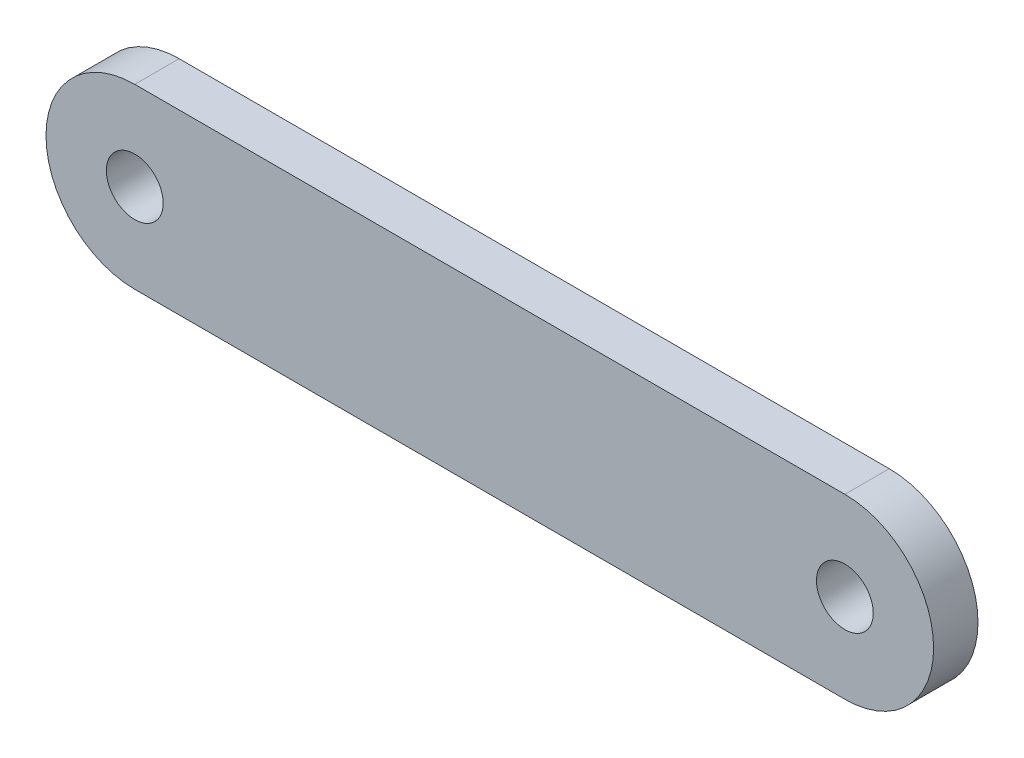
ISO-10303-21;
HEADER;
FILE_DESCRIPTION(('STEP AP214'),'2;1');
FILE_NAME('part.step','',(''),(''),'','','');
FILE_SCHEMA(('AUTOMOTIVE_DESIGN { 1 0 10303 214 1 1 1 1 }'));
ENDSEC;
DATA;
#1=APPLICATION_CONTEXT('core data for automotive mechanical design processes');
#2=APPLICATION_PROTOCOL_DEFINITION('international standard','automotive_design',2000,#1);
#3=PRODUCT_CONTEXT('',#1,'mechanical');
#4=PRODUCT('Part','Part','',(#3));
#5=PRODUCT_RELATED_PRODUCT_CATEGORY('part','',(#4));
#6=PRODUCT_DEFINITION_FORMATION('','',#4);
#7=PRODUCT_DEFINITION_CONTEXT('part definition',#1,'design');
#8=PRODUCT_DEFINITION('design','',#6,#7);
#9=PRODUCT_DEFINITION_SHAPE('','',#8);
#10=(LENGTH_UNIT() NAMED_UNIT(*) SI_UNIT(.MILLI.,.METRE.));
#11=(NAMED_UNIT(*) PLANE_ANGLE_UNIT() SI_UNIT($,.RADIAN.));
#12=(NAMED_UNIT(*) SI_UNIT($,.STERADIAN.) SOLID_ANGLE_UNIT());
#13=UNCERTAINTY_MEASURE_WITH_UNIT(LENGTH_MEASURE(1.E-05),#10,'distance_accuracy_value','');
#14=(GEOMETRIC_REPRESENTATION_CONTEXT(3) GLOBAL_UNCERTAINTY_ASSIGNED_CONTEXT((#13)) GLOBAL_UNIT_ASSIGNED_CONTEXT((#10,
#11,#12)) REPRESENTATION_CONTEXT('',''));
#15=CARTESIAN_POINT('',(0.,0.,0.));
#16=DIRECTION('',(0.,0.,1.));
#17=DIRECTION('',(1.,0.,0.));
#18=AXIS2_PLACEMENT_3D('',#15,#16,#17);
#19=CARTESIAN_POINT('',(0.,0.,3.175));
#20=DIRECTION('',(0.,0.,1.));
#21=DIRECTION('',(1.,0.,0.));
#22=AXIS2_PLACEMENT_3D('',#19,#20,#21);
#23=PLANE('',#22);
#24=CARTESIAN_POINT('',(0.,0.,3.175));
#25=DIRECTION('',(0.,0.,1.));
#26=DIRECTION('',(1.,0.,0.));
#27=AXIS2_PLACEMENT_3D('',#24,#25,#26);
#28=CIRCLE('',#27,2.032);
#29=CARTESIAN_POINT('',(2.032,0.,3.175));
#30=VERTEX_POINT('',#29);
#31=EDGE_CURVE('E118',#30,#30,#28,.T.);
#32=ORIENTED_EDGE('',*,*,#31,.F.);
#33=EDGE_LOOP('',(#32));
#34=FACE_BOUND('',#33,.T.);
#35=CARTESIAN_POINT('',(0.,0.,3.175));
#36=DIRECTION('',(0.,0.,1.));
#37=DIRECTION('',(1.,0.,0.));
#38=AXIS2_PLACEMENT_3D('',#35,#36,#37);
#39=CIRCLE('',#38,6.35);
#40=CARTESIAN_POINT('',(0.,6.35,3.175));
#41=VERTEX_POINT('',#40);
#42=CARTESIAN_POINT('',(0.,-6.35,3.175));
#43=VERTEX_POINT('',#42);
#44=EDGE_CURVE('E98',#41,#43,#39,.T.);
#45=ORIENTED_EDGE('',*,*,#44,.T.);
#46=DIRECTION('',(1.,0.,0.));
#47=VECTOR('',#46,1.);
#48=CARTESIAN_POINT('',(0.,-6.35,3.175));
#49=LINE('',#48,#47);
#50=CARTESIAN_POINT('',(50.8,-6.35,3.175));
#51=VERTEX_POINT('',#50);
#52=EDGE_CURVE('E93',#43,#51,#49,.T.);
#53=ORIENTED_EDGE('',*,*,#52,.T.);
#54=CARTESIAN_POINT('',(50.8,0.,3.175));
#55=DIRECTION('',(0.,0.,1.));
#56=DIRECTION('',(1.,0.,0.));
#57=AXIS2_PLACEMENT_3D('',#54,#55,#56);
#58=CIRCLE('',#57,6.35);
#59=CARTESIAN_POINT('',(50.8,6.35,3.175));
#60=VERTEX_POINT('',#59);
#61=EDGE_CURVE('E96',#51,#60,#58,.T.);
#62=ORIENTED_EDGE('',*,*,#61,.T.);
#63=DIRECTION('',(-1.,0.,0.));
#64=VECTOR('',#63,1.);
#65=CARTESIAN_POINT('',(0.,6.35,3.175));
#66=LINE('',#65,#64);
#67=EDGE_CURVE('E63',#60,#41,#66,.T.);
#68=ORIENTED_EDGE('',*,*,#67,.T.);
#69=EDGE_LOOP('',(#45,#53,#62,#68));
#70=FACE_BOUND('',#69,.T.);
#71=CARTESIAN_POINT('',(50.8,0.,3.175));
#72=DIRECTION('',(0.,0.,1.));
#73=DIRECTION('',(1.,0.,0.));
#74=AXIS2_PLACEMENT_3D('',#71,#72,#73);
#75=CIRCLE('',#74,2.032);
#76=CARTESIAN_POINT('',(52.832,0.,3.175));
#77=VERTEX_POINT('',#76);
#78=EDGE_CURVE('E140',#77,#77,#75,.T.);
#79=ORIENTED_EDGE('',*,*,#78,.F.);
#80=EDGE_LOOP('',(#79));
#81=FACE_BOUND('',#80,.T.);
#82=ADVANCED_FACE('F45',(#34,#70,#81),#23,.T.);
#83=CARTESIAN_POINT('',(0.,0.,0.));
#84=DIRECTION('',(0.,0.,1.));
#85=DIRECTION('',(1.,0.,0.));
#86=AXIS2_PLACEMENT_3D('',#83,#84,#85);
#87=PLANE('',#86);
#88=CARTESIAN_POINT('',(0.,0.,0.));
#89=DIRECTION('',(0.,0.,1.));
#90=DIRECTION('',(1.,0.,0.));
#91=AXIS2_PLACEMENT_3D('',#88,#89,#90);
#92=CIRCLE('',#91,6.35);
#93=CARTESIAN_POINT('',(0.,6.35,0.));
#94=VERTEX_POINT('',#93);
#95=CARTESIAN_POINT('',(0.,-6.35,0.));
#96=VERTEX_POINT('',#95);
#97=EDGE_CURVE('E114',#94,#96,#92,.T.);
#98=ORIENTED_EDGE('',*,*,#97,.F.);
#99=DIRECTION('',(-1.,0.,0.));
#100=VECTOR('',#99,1.);
#101=CARTESIAN_POINT('',(0.,6.35,0.));
#102=LINE('',#101,#100);
#103=CARTESIAN_POINT('',(50.8,6.35,0.));
#104=VERTEX_POINT('',#103);
#105=EDGE_CURVE('E86',#104,#94,#102,.T.);
#106=ORIENTED_EDGE('',*,*,#105,.F.);
#107=CARTESIAN_POINT('',(50.8,0.,0.));
#108=DIRECTION('',(0.,0.,1.));
#109=DIRECTION('',(1.,0.,0.));
#110=AXIS2_PLACEMENT_3D('',#107,#108,#109);
#111=CIRCLE('',#110,6.35);
#112=CARTESIAN_POINT('',(50.8,-6.35,0.));
#113=VERTEX_POINT('',#112);
#114=EDGE_CURVE('E80',#113,#104,#111,.T.);
#115=ORIENTED_EDGE('',*,*,#114,.F.);
#116=DIRECTION('',(1.,0.,0.));
#117=VECTOR('',#116,1.);
#118=CARTESIAN_POINT('',(0.,-6.35,0.));
#119=LINE('',#118,#117);
#120=EDGE_CURVE('E103',#96,#113,#119,.T.);
#121=ORIENTED_EDGE('',*,*,#120,.F.);
#122=EDGE_LOOP('',(#98,#106,#115,#121));
#123=FACE_BOUND('',#122,.T.);
#124=CARTESIAN_POINT('',(0.,0.,0.));
#125=DIRECTION('',(0.,0.,1.));
#126=DIRECTION('',(1.,0.,0.));
#127=AXIS2_PLACEMENT_3D('',#124,#125,#126);
#128=CIRCLE('',#127,2.032);
#129=CARTESIAN_POINT('',(2.032,0.,0.));
#130=VERTEX_POINT('',#129);
#131=EDGE_CURVE('E136',#130,#130,#128,.T.);
#132=ORIENTED_EDGE('',*,*,#131,.T.);
#133=EDGE_LOOP('',(#132));
#134=FACE_BOUND('',#133,.T.);
#135=CARTESIAN_POINT('',(50.8,0.,0.));
#136=DIRECTION('',(0.,0.,1.));
#137=DIRECTION('',(1.,0.,0.));
#138=AXIS2_PLACEMENT_3D('',#135,#136,#137);
#139=CIRCLE('',#138,2.032);
#140=CARTESIAN_POINT('',(52.832,0.,0.));
#141=VERTEX_POINT('',#140);
#142=EDGE_CURVE('E144',#141,#141,#139,.T.);
#143=ORIENTED_EDGE('',*,*,#142,.T.);
#144=EDGE_LOOP('',(#143));
#145=FACE_BOUND('',#144,.T.);
#146=ADVANCED_FACE('F131',(#123,#134,#145),#87,.F.);
#147=CARTESIAN_POINT('',(0.,0.,3.175));
#148=DIRECTION('',(0.,0.,-1.));
#149=DIRECTION('',(-1.,0.,0.));
#150=AXIS2_PLACEMENT_3D('',#147,#148,#149);
#151=CYLINDRICAL_SURFACE('',#150,6.35);
#152=ORIENTED_EDGE('',*,*,#97,.T.);
#153=DIRECTION('',(0.,0.,-1.));
#154=VECTOR('',#153,1.);
#155=CARTESIAN_POINT('',(0.,-6.35,3.175));
#156=LINE('',#155,#154);
#157=EDGE_CURVE('E11',#43,#96,#156,.T.);
#158=ORIENTED_EDGE('',*,*,#157,.F.);
#159=ORIENTED_EDGE('',*,*,#44,.F.);
#160=DIRECTION('',(0.,0.,-1.));
#161=VECTOR('',#160,1.);
#162=CARTESIAN_POINT('',(0.,6.35,3.175));
#163=LINE('',#162,#161);
#164=EDGE_CURVE('E110',#41,#94,#163,.T.);
#165=ORIENTED_EDGE('',*,*,#164,.T.);
#166=EDGE_LOOP('',(#152,#158,#159,#165));
#167=FACE_BOUND('',#166,.T.);
#168=ADVANCED_FACE('F47',(#167),#151,.T.);
#169=CARTESIAN_POINT('',(0.,-6.35,3.175));
#170=DIRECTION('',(0.,1.,0.));
#171=DIRECTION('',(0.,0.,1.));
#172=AXIS2_PLACEMENT_3D('',#169,#170,#171);
#173=PLANE('',#172);
#174=ORIENTED_EDGE('',*,*,#120,.T.);
#175=DIRECTION('',(0.,0.,-1.));
#176=VECTOR('',#175,1.);
#177=CARTESIAN_POINT('',(50.8,-6.35,3.175));
#178=LINE('',#177,#176);
#179=EDGE_CURVE('E55',#51,#113,#178,.T.);
#180=ORIENTED_EDGE('',*,*,#179,.F.);
#181=ORIENTED_EDGE('',*,*,#52,.F.);
#182=ORIENTED_EDGE('',*,*,#157,.T.);
#183=EDGE_LOOP('',(#174,#180,#181,#182));
#184=FACE_BOUND('',#183,.T.);
#185=ADVANCED_FACE('F102',(#184),#173,.F.);
#186=CARTESIAN_POINT('',(50.8,0.,3.175));
#187=DIRECTION('',(0.,0.,-1.));
#188=DIRECTION('',(-1.,0.,0.));
#189=AXIS2_PLACEMENT_3D('',#186,#187,#188);
#190=CYLINDRICAL_SURFACE('',#189,6.35);
#191=ORIENTED_EDGE('',*,*,#114,.T.);
#192=DIRECTION('',(0.,0.,-1.));
#193=VECTOR('',#192,1.);
#194=CARTESIAN_POINT('',(50.8,6.35,3.175));
#195=LINE('',#194,#193);
#196=EDGE_CURVE('E105',#60,#104,#195,.T.);
#197=ORIENTED_EDGE('',*,*,#196,.F.);
#198=ORIENTED_EDGE('',*,*,#61,.F.);
#199=ORIENTED_EDGE('',*,*,#179,.T.);
#200=EDGE_LOOP('',(#191,#197,#198,#199));
#201=FACE_BOUND('',#200,.T.);
#202=ADVANCED_FACE('F106',(#201),#190,.T.);
#203=CARTESIAN_POINT('',(0.,6.35,3.175));
#204=DIRECTION('',(0.,-1.,0.));
#205=DIRECTION('',(0.,0.,-1.));
#206=AXIS2_PLACEMENT_3D('',#203,#204,#205);
#207=PLANE('',#206);
#208=ORIENTED_EDGE('',*,*,#105,.T.);
#209=ORIENTED_EDGE('',*,*,#164,.F.);
#210=ORIENTED_EDGE('',*,*,#67,.F.);
#211=ORIENTED_EDGE('',*,*,#196,.T.);
#212=EDGE_LOOP('',(#208,#209,#210,#211));
#213=FACE_BOUND('',#212,.T.);
#214=ADVANCED_FACE('F128',(#213),#207,.F.);
#215=CARTESIAN_POINT('',(0.,0.,3.175));
#216=DIRECTION('',(0.,0.,-1.));
#217=DIRECTION('',(-1.,0.,0.));
#218=AXIS2_PLACEMENT_3D('',#215,#216,#217);
#219=CYLINDRICAL_SURFACE('',#218,2.032);
#220=ORIENTED_EDGE('',*,*,#31,.T.);
#221=EDGE_LOOP('',(#220));
#222=FACE_BOUND('',#221,.T.);
#223=ORIENTED_EDGE('',*,*,#131,.F.);
#224=EDGE_LOOP('',(#223));
#225=FACE_BOUND('',#224,.T.);
#226=ADVANCED_FACE('F163',(#222,#225),#219,.F.);
#227=CARTESIAN_POINT('',(50.8,0.,3.175));
#228=DIRECTION('',(0.,0.,-1.));
#229=DIRECTION('',(-1.,0.,0.));
#230=AXIS2_PLACEMENT_3D('',#227,#228,#229);
#231=CYLINDRICAL_SURFACE('',#230,2.032);
#232=ORIENTED_EDGE('',*,*,#78,.T.);
#233=EDGE_LOOP('',(#232));
#234=FACE_BOUND('',#233,.T.);
#235=ORIENTED_EDGE('',*,*,#142,.F.);
#236=EDGE_LOOP('',(#235));
#237=FACE_BOUND('',#236,.T.);
#238=ADVANCED_FACE('F152',(#234,#237),#231,.F.);
#239=CLOSED_SHELL('',(#82,#146,#168,#185,#202,#214,#226,#238));
#240=MANIFOLD_SOLID_BREP('B2',#239);
#241=ADVANCED_BREP_SHAPE_REPRESENTATION('',(#18,#240),#14);
#242=SHAPE_DEFINITION_REPRESENTATION(#9,#241);
ENDSEC;
END-ISO-10303-21;
